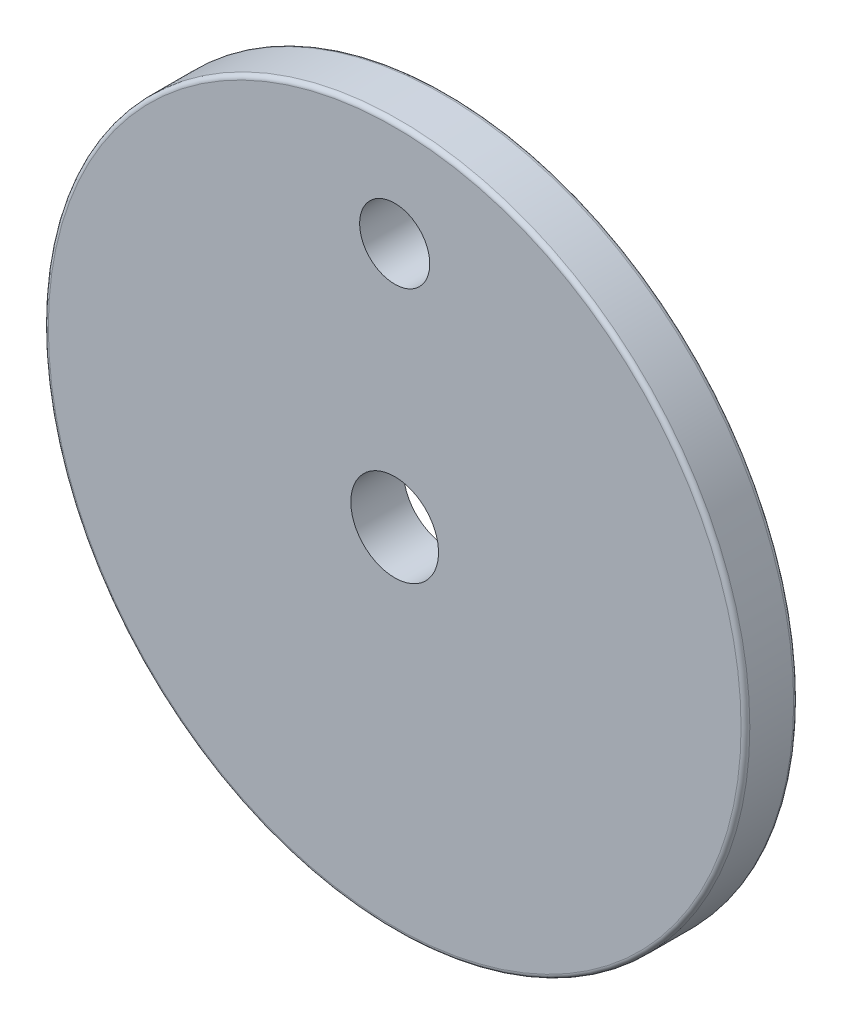
ISO-10303-21;
HEADER;
FILE_DESCRIPTION(('STEP AP214'),'2;1');
FILE_NAME('part.step','',(''),(''),'','','');
FILE_SCHEMA(('AUTOMOTIVE_DESIGN { 1 0 10303 214 1 1 1 1 }'));
ENDSEC;
DATA;
#1=APPLICATION_CONTEXT('core data for automotive mechanical design processes');
#2=APPLICATION_PROTOCOL_DEFINITION('international standard','automotive_design',2000,#1);
#3=PRODUCT_CONTEXT('',#1,'mechanical');
#4=PRODUCT('Part','Part','',(#3));
#5=PRODUCT_RELATED_PRODUCT_CATEGORY('part','',(#4));
#6=PRODUCT_DEFINITION_FORMATION('','',#4);
#7=PRODUCT_DEFINITION_CONTEXT('part definition',#1,'design');
#8=PRODUCT_DEFINITION('design','',#6,#7);
#9=PRODUCT_DEFINITION_SHAPE('','',#8);
#10=(LENGTH_UNIT() NAMED_UNIT(*) SI_UNIT(.MILLI.,.METRE.));
#11=(NAMED_UNIT(*) PLANE_ANGLE_UNIT() SI_UNIT($,.RADIAN.));
#12=(NAMED_UNIT(*) SI_UNIT($,.STERADIAN.) SOLID_ANGLE_UNIT());
#13=UNCERTAINTY_MEASURE_WITH_UNIT(LENGTH_MEASURE(1.E-05),#10,'distance_accuracy_value','');
#14=(GEOMETRIC_REPRESENTATION_CONTEXT(3) GLOBAL_UNCERTAINTY_ASSIGNED_CONTEXT((#13)) GLOBAL_UNIT_ASSIGNED_CONTEXT((#10,
#11,#12)) REPRESENTATION_CONTEXT('',''));
#15=CARTESIAN_POINT('',(0.,0.,0.));
#16=DIRECTION('',(0.,0.,1.));
#17=DIRECTION('',(1.,0.,0.));
#18=AXIS2_PLACEMENT_3D('',#15,#16,#17);
#19=CARTESIAN_POINT('',(0.,0.,38.1));
#20=DIRECTION('',(0.,0.,1.));
#21=DIRECTION('',(1.,0.,0.));
#22=AXIS2_PLACEMENT_3D('',#19,#20,#21);
#23=PLANE('',#22);
#24=CARTESIAN_POINT('',(0.,0.,38.1));
#25=DIRECTION('',(0.,0.,1.));
#26=DIRECTION('',(1.,0.,0.));
#27=AXIS2_PLACEMENT_3D('',#24,#25,#26);
#28=CIRCLE('',#27,501.65);
#29=CARTESIAN_POINT('',(501.65,0.,38.1));
#30=VERTEX_POINT('',#29);
#31=EDGE_CURVE('E10',#30,#30,#28,.T.);
#32=ORIENTED_EDGE('',*,*,#31,.T.);
#33=EDGE_LOOP('',(#32));
#34=FACE_BOUND('',#33,.T.);
#35=CARTESIAN_POINT('',(0.,0.,38.1));
#36=DIRECTION('',(0.,0.,1.));
#37=DIRECTION('',(1.,0.,0.));
#38=AXIS2_PLACEMENT_3D('',#35,#36,#37);
#39=CIRCLE('',#38,63.5);
#40=CARTESIAN_POINT('',(-63.5,0.,38.1));
#41=VERTEX_POINT('',#40);
#42=EDGE_CURVE('E50',#41,#41,#39,.T.);
#43=ORIENTED_EDGE('',*,*,#42,.F.);
#44=EDGE_LOOP('',(#43));
#45=FACE_BOUND('',#44,.T.);
#46=CARTESIAN_POINT('',(0.,355.6,38.1));
#47=DIRECTION('',(0.,0.,1.));
#48=DIRECTION('',(1.,0.,0.));
#49=AXIS2_PLACEMENT_3D('',#46,#47,#48);
#50=CIRCLE('',#49,50.8);
#51=CARTESIAN_POINT('',(-50.8,355.6,38.1));
#52=VERTEX_POINT('',#51);
#53=EDGE_CURVE('E54',#52,#52,#50,.T.);
#54=ORIENTED_EDGE('',*,*,#53,.F.);
#55=EDGE_LOOP('',(#54));
#56=FACE_BOUND('',#55,.T.);
#57=ADVANCED_FACE('F30',(#34,#45,#56),#23,.T.);
#58=CARTESIAN_POINT('',(0.,0.,-38.1));
#59=DIRECTION('',(0.,0.,1.));
#60=DIRECTION('',(1.,0.,0.));
#61=AXIS2_PLACEMENT_3D('',#58,#59,#60);
#62=PLANE('',#61);
#63=CARTESIAN_POINT('',(0.,0.,-38.1));
#64=DIRECTION('',(0.,0.,1.));
#65=DIRECTION('',(1.,0.,0.));
#66=AXIS2_PLACEMENT_3D('',#63,#64,#65);
#67=CIRCLE('',#66,501.65);
#68=CARTESIAN_POINT('',(501.65,0.,-38.1));
#69=VERTEX_POINT('',#68);
#70=EDGE_CURVE('E37',#69,#69,#67,.F.);
#71=ORIENTED_EDGE('',*,*,#70,.T.);
#72=EDGE_LOOP('',(#71));
#73=FACE_BOUND('',#72,.T.);
#74=CARTESIAN_POINT('',(0.,0.,-38.1));
#75=DIRECTION('',(0.,0.,1.));
#76=DIRECTION('',(1.,0.,0.));
#77=AXIS2_PLACEMENT_3D('',#74,#75,#76);
#78=CIRCLE('',#77,63.5);
#79=CARTESIAN_POINT('',(-63.5,0.,-38.1));
#80=VERTEX_POINT('',#79);
#81=EDGE_CURVE('E51',#80,#80,#78,.T.);
#82=ORIENTED_EDGE('',*,*,#81,.T.);
#83=EDGE_LOOP('',(#82));
#84=FACE_BOUND('',#83,.T.);
#85=CARTESIAN_POINT('',(0.,355.6,-38.1));
#86=DIRECTION('',(0.,0.,1.));
#87=DIRECTION('',(1.,0.,0.));
#88=AXIS2_PLACEMENT_3D('',#85,#86,#87);
#89=CIRCLE('',#88,50.8);
#90=CARTESIAN_POINT('',(-50.8,355.6,-38.1));
#91=VERTEX_POINT('',#90);
#92=EDGE_CURVE('E57',#91,#91,#89,.T.);
#93=ORIENTED_EDGE('',*,*,#92,.T.);
#94=EDGE_LOOP('',(#93));
#95=FACE_BOUND('',#94,.T.);
#96=ADVANCED_FACE('F67',(#73,#84,#95),#62,.F.);
#97=CARTESIAN_POINT('',(0.,0.,38.1));
#98=DIRECTION('',(0.,0.,-1.));
#99=DIRECTION('',(-1.,0.,0.));
#100=AXIS2_PLACEMENT_3D('',#97,#98,#99);
#101=CYLINDRICAL_SURFACE('',#100,508.);
#102=CARTESIAN_POINT('',(0.,0.,-31.75));
#103=DIRECTION('',(0.,0.,1.));
#104=DIRECTION('',(1.,0.,0.));
#105=AXIS2_PLACEMENT_3D('',#102,#103,#104);
#106=CIRCLE('',#105,508.);
#107=CARTESIAN_POINT('',(-508.,0.,-31.75));
#108=VERTEX_POINT('',#107);
#109=EDGE_CURVE('E41',#108,#108,#106,.T.);
#110=CARTESIAN_POINT('',(0.,0.,31.75));
#111=DIRECTION('',(0.,0.,1.));
#112=DIRECTION('',(1.,0.,0.));
#113=AXIS2_PLACEMENT_3D('',#110,#111,#112);
#114=CIRCLE('',#113,508.);
#115=CARTESIAN_POINT('',(-508.,0.,31.75));
#116=VERTEX_POINT('',#115);
#117=EDGE_CURVE('E45',#116,#116,#114,.F.);
#118=CARTESIAN_POINT('',(-508.,0.,-31.75));
#119=CARTESIAN_POINT('',(-508.,0.,-31.0885416666667));
#120=CARTESIAN_POINT('',(-508.,0.,-30.4270833333333));
#121=CARTESIAN_POINT('',(-508.,0.,-29.1041666666667));
#122=CARTESIAN_POINT('',(-508.,0.,-28.4427083333333));
#123=CARTESIAN_POINT('',(-508.,0.,-27.1197916666667));
#124=CARTESIAN_POINT('',(-508.,0.,-26.4583333333333));
#125=CARTESIAN_POINT('',(-508.,0.,-25.1354166666667));
#126=CARTESIAN_POINT('',(-508.,0.,-24.4739583333333));
#127=CARTESIAN_POINT('',(-508.,0.,-23.1510416666667));
#128=CARTESIAN_POINT('',(-508.,0.,-22.4895833333333));
#129=CARTESIAN_POINT('',(-508.,0.,-21.1666666666667));
#130=CARTESIAN_POINT('',(-508.,0.,-20.5052083333333));
#131=CARTESIAN_POINT('',(-508.,0.,-19.1822916666667));
#132=CARTESIAN_POINT('',(-508.,0.,-18.5208333333333));
#133=CARTESIAN_POINT('',(-508.,0.,-17.1979166666667));
#134=CARTESIAN_POINT('',(-508.,0.,-16.5364583333333));
#135=CARTESIAN_POINT('',(-508.,0.,-15.2135416666667));
#136=CARTESIAN_POINT('',(-508.,0.,-14.5520833333333));
#137=CARTESIAN_POINT('',(-508.,0.,-13.2291666666667));
#138=CARTESIAN_POINT('',(-508.,0.,-12.5677083333333));
#139=CARTESIAN_POINT('',(-508.,0.,-11.2447916666667));
#140=CARTESIAN_POINT('',(-508.,0.,-10.5833333333333));
#141=CARTESIAN_POINT('',(-508.,0.,-9.26041666666667));
#142=CARTESIAN_POINT('',(-508.,0.,-8.59895833333334));
#143=CARTESIAN_POINT('',(-508.,0.,-7.27604166666667));
#144=CARTESIAN_POINT('',(-508.,0.,-6.61458333333334));
#145=CARTESIAN_POINT('',(-508.,0.,-5.29166666666667));
#146=CARTESIAN_POINT('',(-508.,0.,-4.63020833333334));
#147=CARTESIAN_POINT('',(-508.,0.,-3.30729166666667));
#148=CARTESIAN_POINT('',(-508.,0.,-2.64583333333334));
#149=CARTESIAN_POINT('',(-508.,0.,-1.32291666666668));
#150=CARTESIAN_POINT('',(-508.,0.,-0.661458333333341));
#151=CARTESIAN_POINT('',(-508.,0.,0.661458333333327));
#152=CARTESIAN_POINT('',(-508.,0.,1.32291666666666));
#153=CARTESIAN_POINT('',(-508.,0.,2.64583333333333));
#154=CARTESIAN_POINT('',(-508.,0.,3.30729166666666));
#155=CARTESIAN_POINT('',(-508.,0.,4.63020833333333));
#156=CARTESIAN_POINT('',(-508.,0.,5.29166666666666));
#157=CARTESIAN_POINT('',(-508.,0.,6.61458333333333));
#158=CARTESIAN_POINT('',(-508.,0.,7.27604166666666));
#159=CARTESIAN_POINT('',(-508.,0.,8.59895833333333));
#160=CARTESIAN_POINT('',(-508.,0.,9.26041666666666));
#161=CARTESIAN_POINT('',(-508.,0.,10.5833333333333));
#162=CARTESIAN_POINT('',(-508.,0.,11.2447916666667));
#163=CARTESIAN_POINT('',(-508.,0.,12.5677083333333));
#164=CARTESIAN_POINT('',(-508.,0.,13.2291666666667));
#165=CARTESIAN_POINT('',(-508.,0.,14.5520833333333));
#166=CARTESIAN_POINT('',(-508.,0.,15.2135416666667));
#167=CARTESIAN_POINT('',(-508.,0.,16.5364583333333));
#168=CARTESIAN_POINT('',(-508.,0.,17.1979166666667));
#169=CARTESIAN_POINT('',(-508.,0.,18.5208333333333));
#170=CARTESIAN_POINT('',(-508.,0.,19.1822916666667));
#171=CARTESIAN_POINT('',(-508.,0.,20.5052083333333));
#172=CARTESIAN_POINT('',(-508.,0.,21.1666666666667));
#173=CARTESIAN_POINT('',(-508.,0.,22.4895833333333));
#174=CARTESIAN_POINT('',(-508.,0.,23.1510416666667));
#175=CARTESIAN_POINT('',(-508.,0.,24.4739583333333));
#176=CARTESIAN_POINT('',(-508.,0.,25.1354166666667));
#177=CARTESIAN_POINT('',(-508.,0.,26.4583333333333));
#178=CARTESIAN_POINT('',(-508.,0.,27.1197916666667));
#179=CARTESIAN_POINT('',(-508.,0.,28.4427083333333));
#180=CARTESIAN_POINT('',(-508.,0.,29.1041666666667));
#181=CARTESIAN_POINT('',(-508.,0.,30.4270833333333));
#182=CARTESIAN_POINT('',(-508.,0.,31.0885416666667));
#183=CARTESIAN_POINT('',(-508.,0.,31.75));
#184=B_SPLINE_CURVE_WITH_KNOTS('',3,(#118,#119,#120,#121,#122,#123,#124,#125,#126,#127,#128,
#129,#130,#131,#132,#133,#134,#135,#136,#137,#138,#139,#140,#141,#142,#143,#144,#145,#146,#147,
#148,#149,#150,#151,#152,#153,#154,#155,#156,#157,#158,#159,#160,#161,#162,#163,#164,#165,#166,
#167,#168,#169,#170,#171,#172,#173,#174,#175,#176,#177,#178,#179,#180,#181,#182,#183),
.UNSPECIFIED.,.F.,.F.,(4,2,2,2,2,2,2,2,2,2,2,2,2,2,2,2,2,2,2,2,2,2,2,2,2,2,2,2,2,2,2,2,4),(0.,
1.984375,3.96875000000001,5.953125,7.93749999999999,9.921875,11.90625,13.890625,15.875,
17.859375,19.84375,21.828125,23.8125,25.796875,27.78125,29.765625,31.75,33.734375,35.71875,
37.703125,39.6875,41.671875,43.65625,45.640625,47.625,49.609375,51.59375,53.578125,55.5625,
57.546875,59.53125,61.515625,63.5),.UNSPECIFIED.);
#185=EDGE_CURVE('BSEAM72',#108,#116,#184,.T.);
#186=ORIENTED_EDGE('',*,*,#109,.T.);
#187=ORIENTED_EDGE('',*,*,#117,.T.);
#188=ORIENTED_EDGE('',*,*,#185,.T.);
#189=ORIENTED_EDGE('',*,*,#185,.F.);
#190=EDGE_LOOP('',(#186,#188,#187,#189));
#191=FACE_BOUND('',#190,.T.);
#192=ADVANCED_FACE('F72',(#191),#101,.T.);
#193=CARTESIAN_POINT('',(0.,0.,38.1));
#194=DIRECTION('',(0.,0.,-1.));
#195=DIRECTION('',(-1.,0.,0.));
#196=AXIS2_PLACEMENT_3D('',#193,#194,#195);
#197=CYLINDRICAL_SURFACE('',#196,63.5);
#198=CARTESIAN_POINT('',(-63.5,0.,38.1));
#199=CARTESIAN_POINT('',(-63.5,0.,37.30625));
#200=CARTESIAN_POINT('',(-63.5,0.,36.5125));
#201=CARTESIAN_POINT('',(-63.5,0.,34.925));
#202=CARTESIAN_POINT('',(-63.5,0.,34.13125));
#203=CARTESIAN_POINT('',(-63.5,0.,32.54375));
#204=CARTESIAN_POINT('',(-63.5,0.,31.75));
#205=CARTESIAN_POINT('',(-63.5,0.,30.1625));
#206=CARTESIAN_POINT('',(-63.5,0.,29.36875));
#207=CARTESIAN_POINT('',(-63.5,0.,27.78125));
#208=CARTESIAN_POINT('',(-63.5,0.,26.9875));
#209=CARTESIAN_POINT('',(-63.5,0.,25.4));
#210=CARTESIAN_POINT('',(-63.5,0.,24.60625));
#211=CARTESIAN_POINT('',(-63.5,0.,23.01875));
#212=CARTESIAN_POINT('',(-63.5,0.,22.225));
#213=CARTESIAN_POINT('',(-63.5,0.,20.6375));
#214=CARTESIAN_POINT('',(-63.5,0.,19.84375));
#215=CARTESIAN_POINT('',(-63.5,0.,18.25625));
#216=CARTESIAN_POINT('',(-63.5,0.,17.4625));
#217=CARTESIAN_POINT('',(-63.5,0.,15.875));
#218=CARTESIAN_POINT('',(-63.5,0.,15.08125));
#219=CARTESIAN_POINT('',(-63.5,0.,13.49375));
#220=CARTESIAN_POINT('',(-63.5,0.,12.7));
#221=CARTESIAN_POINT('',(-63.5,0.,11.1125));
#222=CARTESIAN_POINT('',(-63.5,0.,10.31875));
#223=CARTESIAN_POINT('',(-63.5,0.,8.73124999999999));
#224=CARTESIAN_POINT('',(-63.5,0.,7.93749999999999));
#225=CARTESIAN_POINT('',(-63.5,0.,6.35));
#226=CARTESIAN_POINT('',(-63.5,0.,5.55625));
#227=CARTESIAN_POINT('',(-63.5,0.,3.96875));
#228=CARTESIAN_POINT('',(-63.5,0.,3.175));
#229=CARTESIAN_POINT('',(-63.5,0.,1.5875));
#230=CARTESIAN_POINT('',(-63.5,0.,0.793750000000001));
#231=CARTESIAN_POINT('',(-63.5,0.,-0.793750000000001));
#232=CARTESIAN_POINT('',(-63.5,0.,-1.5875));
#233=CARTESIAN_POINT('',(-63.5,0.,-3.175));
#234=CARTESIAN_POINT('',(-63.5,0.,-3.96875));
#235=CARTESIAN_POINT('',(-63.5,0.,-5.55625));
#236=CARTESIAN_POINT('',(-63.5,0.,-6.35));
#237=CARTESIAN_POINT('',(-63.5,0.,-7.93750000000001));
#238=CARTESIAN_POINT('',(-63.5,0.,-8.73125));
#239=CARTESIAN_POINT('',(-63.5,0.,-10.31875));
#240=CARTESIAN_POINT('',(-63.5,0.,-11.1125));
#241=CARTESIAN_POINT('',(-63.5,0.,-12.7));
#242=CARTESIAN_POINT('',(-63.5,0.,-13.49375));
#243=CARTESIAN_POINT('',(-63.5,0.,-15.08125));
#244=CARTESIAN_POINT('',(-63.5,0.,-15.875));
#245=CARTESIAN_POINT('',(-63.5,0.,-17.4625));
#246=CARTESIAN_POINT('',(-63.5,0.,-18.25625));
#247=CARTESIAN_POINT('',(-63.5,0.,-19.84375));
#248=CARTESIAN_POINT('',(-63.5,0.,-20.6375));
#249=CARTESIAN_POINT('',(-63.5,0.,-22.225));
#250=CARTESIAN_POINT('',(-63.5,0.,-23.01875));
#251=CARTESIAN_POINT('',(-63.5,0.,-24.60625));
#252=CARTESIAN_POINT('',(-63.5,0.,-25.4));
#253=CARTESIAN_POINT('',(-63.5,0.,-26.9875));
#254=CARTESIAN_POINT('',(-63.5,0.,-27.78125));
#255=CARTESIAN_POINT('',(-63.5,0.,-29.36875));
#256=CARTESIAN_POINT('',(-63.5,0.,-30.1625));
#257=CARTESIAN_POINT('',(-63.5,0.,-31.75));
#258=CARTESIAN_POINT('',(-63.5,0.,-32.54375));
#259=CARTESIAN_POINT('',(-63.5,0.,-34.13125));
#260=CARTESIAN_POINT('',(-63.5,0.,-34.925));
#261=CARTESIAN_POINT('',(-63.5,0.,-36.5125));
#262=CARTESIAN_POINT('',(-63.5,0.,-37.30625));
#263=CARTESIAN_POINT('',(-63.5,0.,-38.1));
#264=B_SPLINE_CURVE_WITH_KNOTS('',3,(#198,#199,#200,#201,#202,#203,#204,#205,#206,#207,#208,
#209,#210,#211,#212,#213,#214,#215,#216,#217,#218,#219,#220,#221,#222,#223,#224,#225,#226,#227,
#228,#229,#230,#231,#232,#233,#234,#235,#236,#237,#238,#239,#240,#241,#242,#243,#244,#245,#246,
#247,#248,#249,#250,#251,#252,#253,#254,#255,#256,#257,#258,#259,#260,#261,#262,#263),
.UNSPECIFIED.,.F.,.F.,(4,2,2,2,2,2,2,2,2,2,2,2,2,2,2,2,2,2,2,2,2,2,2,2,2,2,2,2,2,2,2,2,4),(0.,
2.38125,4.7625,7.14375,9.52500000000001,11.90625,14.2875,16.66875,19.05,21.43125,23.8125,
26.19375,28.575,30.95625,33.3375,35.71875,38.1,40.48125,42.8625,45.24375,47.625,50.00625,
52.3875,54.76875,57.15,59.53125,61.9125,64.29375,66.675,69.05625,71.4375,73.81875,76.2),.UNSPECIFIED.);
#265=EDGE_CURVE('BSEAM76',#41,#80,#264,.T.);
#266=ORIENTED_EDGE('',*,*,#42,.T.);
#267=ORIENTED_EDGE('',*,*,#81,.F.);
#268=ORIENTED_EDGE('',*,*,#265,.T.);
#269=ORIENTED_EDGE('',*,*,#265,.F.);
#270=EDGE_LOOP('',(#266,#268,#267,#269));
#271=FACE_BOUND('',#270,.T.);
#272=ADVANCED_FACE('F76',(#271),#197,.F.);
#273=CARTESIAN_POINT('',(0.,355.6,38.1));
#274=DIRECTION('',(0.,0.,-1.));
#275=DIRECTION('',(-1.,0.,0.));
#276=AXIS2_PLACEMENT_3D('',#273,#274,#275);
#277=CYLINDRICAL_SURFACE('',#276,50.8);
#278=CARTESIAN_POINT('',(-50.8,355.6,38.1));
#279=CARTESIAN_POINT('',(-50.8,355.6,37.30625));
#280=CARTESIAN_POINT('',(-50.8,355.6,36.5125));
#281=CARTESIAN_POINT('',(-50.8,355.6,34.925));
#282=CARTESIAN_POINT('',(-50.8,355.6,34.13125));
#283=CARTESIAN_POINT('',(-50.8,355.6,32.54375));
#284=CARTESIAN_POINT('',(-50.8,355.6,31.75));
#285=CARTESIAN_POINT('',(-50.8,355.6,30.1625));
#286=CARTESIAN_POINT('',(-50.8,355.6,29.36875));
#287=CARTESIAN_POINT('',(-50.8,355.6,27.78125));
#288=CARTESIAN_POINT('',(-50.8,355.6,26.9875));
#289=CARTESIAN_POINT('',(-50.8,355.6,25.4));
#290=CARTESIAN_POINT('',(-50.8,355.6,24.60625));
#291=CARTESIAN_POINT('',(-50.8,355.6,23.01875));
#292=CARTESIAN_POINT('',(-50.8,355.6,22.225));
#293=CARTESIAN_POINT('',(-50.8,355.6,20.6375));
#294=CARTESIAN_POINT('',(-50.8,355.6,19.84375));
#295=CARTESIAN_POINT('',(-50.8,355.6,18.25625));
#296=CARTESIAN_POINT('',(-50.8,355.6,17.4625));
#297=CARTESIAN_POINT('',(-50.8,355.6,15.875));
#298=CARTESIAN_POINT('',(-50.8,355.6,15.08125));
#299=CARTESIAN_POINT('',(-50.8,355.6,13.49375));
#300=CARTESIAN_POINT('',(-50.8,355.6,12.7));
#301=CARTESIAN_POINT('',(-50.8,355.6,11.1125));
#302=CARTESIAN_POINT('',(-50.8,355.6,10.31875));
#303=CARTESIAN_POINT('',(-50.8,355.6,8.73124999999999));
#304=CARTESIAN_POINT('',(-50.8,355.6,7.93749999999999));
#305=CARTESIAN_POINT('',(-50.8,355.6,6.34999999999999));
#306=CARTESIAN_POINT('',(-50.8,355.6,5.55625));
#307=CARTESIAN_POINT('',(-50.8,355.6,3.96875));
#308=CARTESIAN_POINT('',(-50.8,355.6,3.17499999999999));
#309=CARTESIAN_POINT('',(-50.8,355.6,1.58749999999999));
#310=CARTESIAN_POINT('',(-50.8,355.6,0.793749999999994));
#311=CARTESIAN_POINT('',(-50.8,355.6,-0.793750000000007));
#312=CARTESIAN_POINT('',(-50.8,355.6,-1.58750000000001));
#313=CARTESIAN_POINT('',(-50.8,355.6,-3.17500000000001));
#314=CARTESIAN_POINT('',(-50.8,355.6,-3.96875000000001));
#315=CARTESIAN_POINT('',(-50.8,355.6,-5.55625000000001));
#316=CARTESIAN_POINT('',(-50.8,355.6,-6.35000000000001));
#317=CARTESIAN_POINT('',(-50.8,355.6,-7.93750000000001));
#318=CARTESIAN_POINT('',(-50.8,355.6,-8.73125000000001));
#319=CARTESIAN_POINT('',(-50.8,355.6,-10.31875));
#320=CARTESIAN_POINT('',(-50.8,355.6,-11.1125));
#321=CARTESIAN_POINT('',(-50.8,355.6,-12.7));
#322=CARTESIAN_POINT('',(-50.8,355.6,-13.49375));
#323=CARTESIAN_POINT('',(-50.8,355.6,-15.08125));
#324=CARTESIAN_POINT('',(-50.8,355.6,-15.875));
#325=CARTESIAN_POINT('',(-50.8,355.6,-17.4625));
#326=CARTESIAN_POINT('',(-50.8,355.6,-18.25625));
#327=CARTESIAN_POINT('',(-50.8,355.6,-19.84375));
#328=CARTESIAN_POINT('',(-50.8,355.6,-20.6375));
#329=CARTESIAN_POINT('',(-50.8,355.6,-22.225));
#330=CARTESIAN_POINT('',(-50.8,355.6,-23.01875));
#331=CARTESIAN_POINT('',(-50.8,355.6,-24.60625));
#332=CARTESIAN_POINT('',(-50.8,355.6,-25.4));
#333=CARTESIAN_POINT('',(-50.8,355.6,-26.9875));
#334=CARTESIAN_POINT('',(-50.8,355.6,-27.78125));
#335=CARTESIAN_POINT('',(-50.8,355.6,-29.36875));
#336=CARTESIAN_POINT('',(-50.8,355.6,-30.1625));
#337=CARTESIAN_POINT('',(-50.8,355.6,-31.75));
#338=CARTESIAN_POINT('',(-50.8,355.6,-32.54375));
#339=CARTESIAN_POINT('',(-50.8,355.6,-34.13125));
#340=CARTESIAN_POINT('',(-50.8,355.6,-34.925));
#341=CARTESIAN_POINT('',(-50.8,355.6,-36.5125));
#342=CARTESIAN_POINT('',(-50.8,355.6,-37.30625));
#343=CARTESIAN_POINT('',(-50.8,355.6,-38.1));
#344=B_SPLINE_CURVE_WITH_KNOTS('',3,(#278,#279,#280,#281,#282,#283,#284,#285,#286,#287,#288,
#289,#290,#291,#292,#293,#294,#295,#296,#297,#298,#299,#300,#301,#302,#303,#304,#305,#306,#307,
#308,#309,#310,#311,#312,#313,#314,#315,#316,#317,#318,#319,#320,#321,#322,#323,#324,#325,#326,
#327,#328,#329,#330,#331,#332,#333,#334,#335,#336,#337,#338,#339,#340,#341,#342,#343),
.UNSPECIFIED.,.F.,.F.,(4,2,2,2,2,2,2,2,2,2,2,2,2,2,2,2,2,2,2,2,2,2,2,2,2,2,2,2,2,2,2,2,4),(0.,
2.38124999999999,4.7625,7.14375,9.525,11.90625,14.2875,16.66875,19.05,21.43125,23.8125,26.19375,
28.575,30.95625,33.3375,35.71875,38.1,40.48125,42.8625,45.24375,47.625,50.00625,52.3875,
54.76875,57.15,59.53125,61.9125,64.29375,66.675,69.05625,71.4375,73.81875,76.2),.UNSPECIFIED.);
#345=EDGE_CURVE('BSEAM63',#52,#91,#344,.T.);
#346=ORIENTED_EDGE('',*,*,#53,.T.);
#347=ORIENTED_EDGE('',*,*,#92,.F.);
#348=ORIENTED_EDGE('',*,*,#345,.T.);
#349=ORIENTED_EDGE('',*,*,#345,.F.);
#350=EDGE_LOOP('',(#346,#348,#347,#349));
#351=FACE_BOUND('',#350,.T.);
#352=ADVANCED_FACE('F63',(#351),#277,.F.);
#353=CARTESIAN_POINT('',(0.,0.,-31.75));
#354=DIRECTION('',(0.,0.,1.));
#355=DIRECTION('',(1.,0.,0.));
#356=AXIS2_PLACEMENT_3D('',#353,#354,#355);
#357=TOROIDAL_SURFACE('',#356,501.65,6.35);
#358=ORIENTED_EDGE('',*,*,#70,.F.);
#359=EDGE_LOOP('',(#358));
#360=FACE_BOUND('',#359,.T.);
#361=ORIENTED_EDGE('',*,*,#109,.F.);
#362=EDGE_LOOP('',(#361));
#363=FACE_BOUND('',#362,.T.);
#364=ADVANCED_FACE('F81',(#360,#363),#357,.T.);
#365=CARTESIAN_POINT('',(0.,0.,31.75));
#366=DIRECTION('',(0.,0.,1.));
#367=DIRECTION('',(1.,0.,0.));
#368=AXIS2_PLACEMENT_3D('',#365,#366,#367);
#369=TOROIDAL_SURFACE('',#368,501.65,6.35);
#370=ORIENTED_EDGE('',*,*,#117,.F.);
#371=EDGE_LOOP('',(#370));
#372=FACE_BOUND('',#371,.T.);
#373=ORIENTED_EDGE('',*,*,#31,.F.);
#374=EDGE_LOOP('',(#373));
#375=FACE_BOUND('',#374,.T.);
#376=ADVANCED_FACE('F32',(#372,#375),#369,.T.);
#377=CLOSED_SHELL('',(#57,#96,#192,#272,#352,#364,#376));
#378=MANIFOLD_SOLID_BREP('B2',#377);
#379=ADVANCED_BREP_SHAPE_REPRESENTATION('',(#18,#378),#14);
#380=SHAPE_DEFINITION_REPRESENTATION(#9,#379);
ENDSEC;
END-ISO-10303-21;
